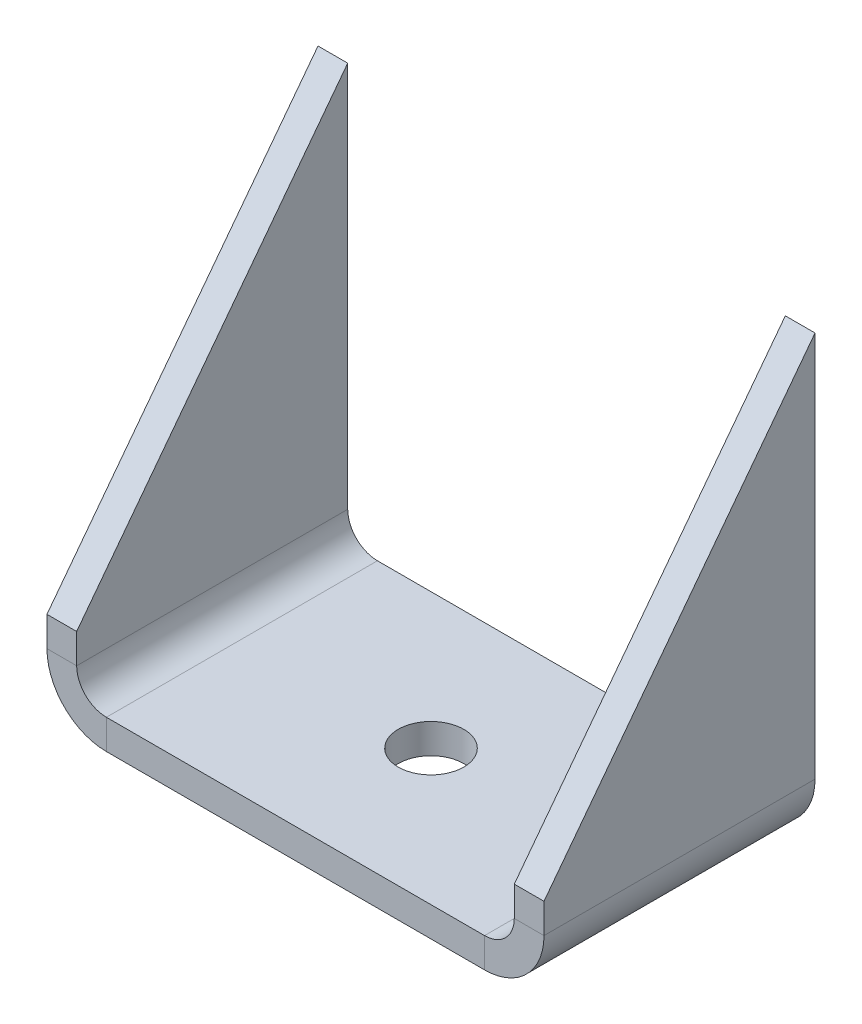
ISO-10303-21;
HEADER;
FILE_DESCRIPTION(('STEP AP214'),'2;1');
FILE_NAME('part.step','',(''),(''),'','','');
FILE_SCHEMA(('AUTOMOTIVE_DESIGN { 1 0 10303 214 1 1 1 1 }'));
ENDSEC;
DATA;
#1=APPLICATION_CONTEXT('core data for automotive mechanical design processes');
#2=APPLICATION_PROTOCOL_DEFINITION('international standard','automotive_design',2000,#1);
#3=PRODUCT_CONTEXT('',#1,'mechanical');
#4=PRODUCT('Part','Part','',(#3));
#5=PRODUCT_RELATED_PRODUCT_CATEGORY('part','',(#4));
#6=PRODUCT_DEFINITION_FORMATION('','',#4);
#7=PRODUCT_DEFINITION_CONTEXT('part definition',#1,'design');
#8=PRODUCT_DEFINITION('design','',#6,#7);
#9=PRODUCT_DEFINITION_SHAPE('','',#8);
#10=(LENGTH_UNIT() NAMED_UNIT(*) SI_UNIT(.MILLI.,.METRE.));
#11=(NAMED_UNIT(*) PLANE_ANGLE_UNIT() SI_UNIT($,.RADIAN.));
#12=(NAMED_UNIT(*) SI_UNIT($,.STERADIAN.) SOLID_ANGLE_UNIT());
#13=UNCERTAINTY_MEASURE_WITH_UNIT(LENGTH_MEASURE(1.E-05),#10,'distance_accuracy_value','');
#14=(GEOMETRIC_REPRESENTATION_CONTEXT(3) GLOBAL_UNCERTAINTY_ASSIGNED_CONTEXT((#13)) GLOBAL_UNIT_ASSIGNED_CONTEXT((#10,
#11,#12)) REPRESENTATION_CONTEXT('',''));
#15=CARTESIAN_POINT('',(0.,0.,0.));
#16=DIRECTION('',(0.,0.,1.));
#17=DIRECTION('',(1.,0.,0.));
#18=AXIS2_PLACEMENT_3D('',#15,#16,#17);
#19=CARTESIAN_POINT('',(0.,-3.175,0.));
#20=DIRECTION('',(0.,-1.,0.));
#21=DIRECTION('',(0.,0.,-1.));
#22=AXIS2_PLACEMENT_3D('',#19,#20,#21);
#23=PLANE('',#22);
#24=CARTESIAN_POINT('',(26.549999986,-3.175,-14.478));
#25=DIRECTION('',(0.,1.,0.));
#26=DIRECTION('',(0.,0.,1.));
#27=AXIS2_PLACEMENT_3D('',#24,#25,#26);
#28=CIRCLE('',#27,3.5);
#29=CARTESIAN_POINT('',(26.549999986,-3.175,-10.978));
#30=VERTEX_POINT('',#29);
#31=EDGE_CURVE('E219',#30,#30,#28,.T.);
#32=ORIENTED_EDGE('',*,*,#31,.T.);
#33=EDGE_LOOP('',(#32));
#34=FACE_BOUND('',#33,.T.);
#35=DIRECTION('',(1.,0.,0.));
#36=VECTOR('',#35,1.);
#37=CARTESIAN_POINT('',(0.,-3.175,0.));
#38=LINE('',#37,#36);
#39=CARTESIAN_POINT('',(6.34999999999999,-3.175,0.));
#40=VERTEX_POINT('',#39);
#41=CARTESIAN_POINT('',(46.749999972,-3.175,0.));
#42=VERTEX_POINT('',#41);
#43=EDGE_CURVE('E87',#40,#42,#38,.T.);
#44=ORIENTED_EDGE('',*,*,#43,.F.);
#45=DIRECTION('',(0.,0.,1.));
#46=VECTOR('',#45,1.);
#47=CARTESIAN_POINT('',(6.34999999999999,-3.175,0.));
#48=LINE('',#47,#46);
#49=CARTESIAN_POINT('',(6.34999999999998,-3.175,-28.956));
#50=VERTEX_POINT('',#49);
#51=EDGE_CURVE('E173',#40,#50,#48,.F.);
#52=ORIENTED_EDGE('',*,*,#51,.T.);
#53=DIRECTION('',(-1.,0.,0.));
#54=VECTOR('',#53,1.);
#55=CARTESIAN_POINT('',(0.,-3.175,-28.956));
#56=LINE('',#55,#54);
#57=CARTESIAN_POINT('',(46.749999972,-3.175,-28.956));
#58=VERTEX_POINT('',#57);
#59=EDGE_CURVE('E13',#58,#50,#56,.T.);
#60=ORIENTED_EDGE('',*,*,#59,.F.);
#61=DIRECTION('',(0.,0.,-1.));
#62=VECTOR('',#61,1.);
#63=CARTESIAN_POINT('',(46.749999972,-3.175,-28.956));
#64=LINE('',#63,#62);
#65=EDGE_CURVE('E262',#58,#42,#64,.F.);
#66=ORIENTED_EDGE('',*,*,#65,.T.);
#67=EDGE_LOOP('',(#44,#52,#60,#66));
#68=FACE_BOUND('',#67,.T.);
#69=ADVANCED_FACE('F78',(#34,#68),#23,.T.);
#70=CARTESIAN_POINT('',(0.,0.,0.));
#71=DIRECTION('',(0.,-1.,0.));
#72=DIRECTION('',(0.,0.,-1.));
#73=AXIS2_PLACEMENT_3D('',#70,#71,#72);
#74=PLANE('',#73);
#75=CARTESIAN_POINT('',(26.549999986,0.,-14.478));
#76=DIRECTION('',(0.,1.,0.));
#77=DIRECTION('',(0.,0.,1.));
#78=AXIS2_PLACEMENT_3D('',#75,#76,#77);
#79=CIRCLE('',#78,3.49999999999999);
#80=CARTESIAN_POINT('',(26.549999986,0.,-10.978));
#81=VERTEX_POINT('',#80);
#82=EDGE_CURVE('E318',#81,#81,#79,.T.);
#83=ORIENTED_EDGE('',*,*,#82,.F.);
#84=EDGE_LOOP('',(#83));
#85=FACE_BOUND('',#84,.T.);
#86=DIRECTION('',(0.,0.,1.));
#87=VECTOR('',#86,1.);
#88=CARTESIAN_POINT('',(6.34999999999999,0.,0.));
#89=LINE('',#88,#87);
#90=CARTESIAN_POINT('',(6.34999999999999,0.,0.));
#91=VERTEX_POINT('',#90);
#92=CARTESIAN_POINT('',(6.34999999999998,0.,-28.956));
#93=VERTEX_POINT('',#92);
#94=EDGE_CURVE('E225',#91,#93,#89,.F.);
#95=ORIENTED_EDGE('',*,*,#94,.F.);
#96=DIRECTION('',(1.,0.,0.));
#97=VECTOR('',#96,1.);
#98=CARTESIAN_POINT('',(0.,0.,0.));
#99=LINE('',#98,#97);
#100=CARTESIAN_POINT('',(46.749999972,0.,0.));
#101=VERTEX_POINT('',#100);
#102=EDGE_CURVE('E279',#91,#101,#99,.T.);
#103=ORIENTED_EDGE('',*,*,#102,.T.);
#104=DIRECTION('',(0.,0.,-1.));
#105=VECTOR('',#104,1.);
#106=CARTESIAN_POINT('',(46.749999972,0.,-28.956));
#107=LINE('',#106,#105);
#108=CARTESIAN_POINT('',(46.749999972,0.,-28.956));
#109=VERTEX_POINT('',#108);
#110=EDGE_CURVE('E273',#109,#101,#107,.F.);
#111=ORIENTED_EDGE('',*,*,#110,.F.);
#112=DIRECTION('',(-1.,0.,0.));
#113=VECTOR('',#112,1.);
#114=CARTESIAN_POINT('',(0.,0.,-28.956));
#115=LINE('',#114,#113);
#116=EDGE_CURVE('E82',#109,#93,#115,.T.);
#117=ORIENTED_EDGE('',*,*,#116,.T.);
#118=EDGE_LOOP('',(#95,#103,#111,#117));
#119=FACE_BOUND('',#118,.T.);
#120=ADVANCED_FACE('F291',(#85,#119),#74,.F.);
#121=CARTESIAN_POINT('',(0.,-3.175,0.));
#122=DIRECTION('',(0.,0.,1.));
#123=DIRECTION('',(1.,0.,0.));
#124=AXIS2_PLACEMENT_3D('',#121,#122,#123);
#125=PLANE('',#124);
#126=ORIENTED_EDGE('',*,*,#102,.F.);
#127=DIRECTION('',(0.,-1.,0.));
#128=VECTOR('',#127,1.);
#129=CARTESIAN_POINT('',(6.34999999999999,0.,0.));
#130=LINE('',#129,#128);
#131=EDGE_CURVE('E221',#91,#40,#130,.T.);
#132=ORIENTED_EDGE('',*,*,#131,.T.);
#133=ORIENTED_EDGE('',*,*,#43,.T.);
#134=DIRECTION('',(0.,-1.,0.));
#135=VECTOR('',#134,1.);
#136=CARTESIAN_POINT('',(46.749999972,0.,0.));
#137=LINE('',#136,#135);
#138=EDGE_CURVE('E277',#101,#42,#137,.T.);
#139=ORIENTED_EDGE('',*,*,#138,.F.);
#140=EDGE_LOOP('',(#126,#132,#133,#139));
#141=FACE_BOUND('',#140,.T.);
#142=ADVANCED_FACE('F80',(#141),#125,.T.);
#143=CARTESIAN_POINT('',(0.,-3.175,-28.956));
#144=DIRECTION('',(0.,0.,-1.));
#145=DIRECTION('',(-1.,0.,0.));
#146=AXIS2_PLACEMENT_3D('',#143,#144,#145);
#147=PLANE('',#146);
#148=DIRECTION('',(0.,-1.,0.));
#149=VECTOR('',#148,1.);
#150=CARTESIAN_POINT('',(6.34999999999998,0.,-28.956));
#151=LINE('',#150,#149);
#152=EDGE_CURVE('E228',#93,#50,#151,.T.);
#153=ORIENTED_EDGE('',*,*,#152,.F.);
#154=ORIENTED_EDGE('',*,*,#116,.F.);
#155=DIRECTION('',(0.,-1.,0.));
#156=VECTOR('',#155,1.);
#157=CARTESIAN_POINT('',(46.749999972,0.,-28.956));
#158=LINE('',#157,#156);
#159=EDGE_CURVE('E267',#109,#58,#158,.T.);
#160=ORIENTED_EDGE('',*,*,#159,.T.);
#161=ORIENTED_EDGE('',*,*,#59,.T.);
#162=EDGE_LOOP('',(#153,#154,#160,#161));
#163=FACE_BOUND('',#162,.T.);
#164=ADVANCED_FACE('F294',(#163),#147,.T.);
#165=CARTESIAN_POINT('',(46.749999972,3.175,0.));
#166=DIRECTION('',(0.,0.,1.));
#167=DIRECTION('',(1.,0.,0.));
#168=AXIS2_PLACEMENT_3D('',#165,#166,#167);
#169=PLANE('',#168);
#170=DIRECTION('',(-1.,0.,0.));
#171=VECTOR('',#170,1.);
#172=CARTESIAN_POINT('',(53.099999972,3.17499999999998,0.));
#173=LINE('',#172,#171);
#174=CARTESIAN_POINT('',(49.924999972,3.17499999999999,0.));
#175=VERTEX_POINT('',#174);
#176=CARTESIAN_POINT('',(53.099999972,3.17499999999998,0.));
#177=VERTEX_POINT('',#176);
#178=EDGE_CURVE('E230',#175,#177,#173,.F.);
#179=ORIENTED_EDGE('',*,*,#178,.F.);
#180=CARTESIAN_POINT('',(46.749999972,3.175,0.));
#181=DIRECTION('',(0.,0.,-1.));
#182=DIRECTION('',(-1.,0.,0.));
#183=AXIS2_PLACEMENT_3D('',#180,#181,#182);
#184=CIRCLE('',#183,3.175);
#185=EDGE_CURVE('E270',#101,#175,#184,.F.);
#186=ORIENTED_EDGE('',*,*,#185,.F.);
#187=ORIENTED_EDGE('',*,*,#138,.T.);
#188=CARTESIAN_POINT('',(46.749999972,3.175,0.));
#189=DIRECTION('',(0.,0.,-1.));
#190=DIRECTION('',(-1.,0.,0.));
#191=AXIS2_PLACEMENT_3D('',#188,#189,#190);
#192=CIRCLE('',#191,6.35);
#193=EDGE_CURVE('E95',#42,#177,#192,.F.);
#194=ORIENTED_EDGE('',*,*,#193,.T.);
#195=EDGE_LOOP('',(#179,#186,#187,#194));
#196=FACE_BOUND('',#195,.T.);
#197=ADVANCED_FACE('F335',(#196),#169,.T.);
#198=CARTESIAN_POINT('',(46.749999972,3.175,-28.956));
#199=DIRECTION('',(0.,0.,1.));
#200=DIRECTION('',(1.,0.,0.));
#201=AXIS2_PLACEMENT_3D('',#198,#199,#200);
#202=PLANE('',#201);
#203=CARTESIAN_POINT('',(46.749999972,3.175,-28.956));
#204=DIRECTION('',(0.,0.,-1.));
#205=DIRECTION('',(-1.,0.,0.));
#206=AXIS2_PLACEMENT_3D('',#203,#204,#205);
#207=CIRCLE('',#206,3.175);
#208=CARTESIAN_POINT('',(49.924999972,3.17499999999999,-28.956));
#209=VERTEX_POINT('',#208);
#210=EDGE_CURVE('E235',#209,#109,#207,.T.);
#211=ORIENTED_EDGE('',*,*,#210,.F.);
#212=DIRECTION('',(-1.,0.,0.));
#213=VECTOR('',#212,1.);
#214=CARTESIAN_POINT('',(49.924999972,3.17499999999999,-28.956));
#215=LINE('',#214,#213);
#216=CARTESIAN_POINT('',(53.099999972,3.17499999999998,-28.956));
#217=VERTEX_POINT('',#216);
#218=EDGE_CURVE('E255',#209,#217,#215,.F.);
#219=ORIENTED_EDGE('',*,*,#218,.T.);
#220=CARTESIAN_POINT('',(46.749999972,3.175,-28.956));
#221=DIRECTION('',(0.,0.,-1.));
#222=DIRECTION('',(-1.,0.,0.));
#223=AXIS2_PLACEMENT_3D('',#220,#221,#222);
#224=CIRCLE('',#223,6.35);
#225=EDGE_CURVE('E265',#217,#58,#224,.T.);
#226=ORIENTED_EDGE('',*,*,#225,.T.);
#227=ORIENTED_EDGE('',*,*,#159,.F.);
#228=EDGE_LOOP('',(#211,#219,#226,#227));
#229=FACE_BOUND('',#228,.T.);
#230=ADVANCED_FACE('F339',(#229),#202,.F.);
#231=CARTESIAN_POINT('',(46.749999972,3.175,-28.956));
#232=DIRECTION('',(0.,0.,-1.));
#233=DIRECTION('',(1.,0.,0.));
#234=AXIS2_PLACEMENT_3D('',#231,#232,#233);
#235=CYLINDRICAL_SURFACE('',#234,6.35);
#236=ORIENTED_EDGE('',*,*,#65,.F.);
#237=ORIENTED_EDGE('',*,*,#225,.F.);
#238=DIRECTION('',(0.,0.,-1.));
#239=VECTOR('',#238,1.);
#240=CARTESIAN_POINT('',(53.099999972,3.17499999999998,0.));
#241=LINE('',#240,#239);
#242=EDGE_CURVE('E253',#217,#177,#241,.F.);
#243=ORIENTED_EDGE('',*,*,#242,.T.);
#244=ORIENTED_EDGE('',*,*,#193,.F.);
#245=EDGE_LOOP('',(#236,#237,#243,#244));
#246=FACE_BOUND('',#245,.T.);
#247=ADVANCED_FACE('F345',(#246),#235,.T.);
#248=CARTESIAN_POINT('',(46.749999972,3.175,-28.956));
#249=DIRECTION('',(0.,0.,-1.));
#250=DIRECTION('',(1.,0.,0.));
#251=AXIS2_PLACEMENT_3D('',#248,#249,#250);
#252=CYLINDRICAL_SURFACE('',#251,3.175);
#253=ORIENTED_EDGE('',*,*,#110,.T.);
#254=ORIENTED_EDGE('',*,*,#185,.T.);
#255=DIRECTION('',(0.,0.,-1.));
#256=VECTOR('',#255,1.);
#257=CARTESIAN_POINT('',(49.924999972,3.17499999999999,0.));
#258=LINE('',#257,#256);
#259=EDGE_CURVE('E258',#175,#209,#258,.T.);
#260=ORIENTED_EDGE('',*,*,#259,.T.);
#261=ORIENTED_EDGE('',*,*,#210,.T.);
#262=EDGE_LOOP('',(#253,#254,#260,#261));
#263=FACE_BOUND('',#262,.T.);
#264=ADVANCED_FACE('F348',(#263),#252,.F.);
#265=CARTESIAN_POINT('',(53.099999972,0.,0.));
#266=DIRECTION('',(0.,0.,-1.));
#267=DIRECTION('',(-1.,0.,0.));
#268=AXIS2_PLACEMENT_3D('',#265,#266,#267);
#269=PLANE('',#268);
#270=ORIENTED_EDGE('',*,*,#178,.T.);
#271=DIRECTION('',(0.,-1.,0.));
#272=VECTOR('',#271,1.);
#273=CARTESIAN_POINT('',(53.099999972,-1.85158807315324E-13,0.));
#274=LINE('',#273,#272);
#275=CARTESIAN_POINT('',(53.099999972,6.34999999999999,0.));
#276=VERTEX_POINT('',#275);
#277=EDGE_CURVE('E243',#276,#177,#274,.T.);
#278=ORIENTED_EDGE('',*,*,#277,.F.);
#279=DIRECTION('',(-1.,0.,0.));
#280=VECTOR('',#279,1.);
#281=CARTESIAN_POINT('',(53.099999972,6.34999999999999,0.));
#282=LINE('',#281,#280);
#283=CARTESIAN_POINT('',(49.924999972,6.35,0.));
#284=VERTEX_POINT('',#283);
#285=EDGE_CURVE('E236',#276,#284,#282,.T.);
#286=ORIENTED_EDGE('',*,*,#285,.T.);
#287=DIRECTION('',(0.,1.,0.));
#288=VECTOR('',#287,1.);
#289=CARTESIAN_POINT('',(49.924999972,0.,0.));
#290=LINE('',#289,#288);
#291=EDGE_CURVE('E250',#284,#175,#290,.F.);
#292=ORIENTED_EDGE('',*,*,#291,.T.);
#293=EDGE_LOOP('',(#270,#278,#286,#292));
#294=FACE_BOUND('',#293,.T.);
#295=ADVANCED_FACE('F351',(#294),#269,.F.);
#296=CARTESIAN_POINT('',(53.0999999720001,44.45,-28.956));
#297=DIRECTION('',(0.,0.,1.));
#298=DIRECTION('',(0.,-1.,0.));
#299=AXIS2_PLACEMENT_3D('',#296,#297,#298);
#300=PLANE('',#299);
#301=ORIENTED_EDGE('',*,*,#218,.F.);
#302=DIRECTION('',(0.,-1.,0.));
#303=VECTOR('',#302,1.);
#304=CARTESIAN_POINT('',(49.9249999720001,44.45,-28.956));
#305=LINE('',#304,#303);
#306=CARTESIAN_POINT('',(49.9249999720001,44.45,-28.956));
#307=VERTEX_POINT('',#306);
#308=EDGE_CURVE('E248',#209,#307,#305,.F.);
#309=ORIENTED_EDGE('',*,*,#308,.T.);
#310=DIRECTION('',(-1.,0.,0.));
#311=VECTOR('',#310,1.);
#312=CARTESIAN_POINT('',(53.0999999720001,44.45,-28.956));
#313=LINE('',#312,#311);
#314=CARTESIAN_POINT('',(53.0999999720001,44.45,-28.956));
#315=VERTEX_POINT('',#314);
#316=EDGE_CURVE('E232',#315,#307,#313,.T.);
#317=ORIENTED_EDGE('',*,*,#316,.F.);
#318=DIRECTION('',(0.,1.,0.));
#319=VECTOR('',#318,1.);
#320=CARTESIAN_POINT('',(53.099999972,-1.82898710443765E-13,-28.956));
#321=LINE('',#320,#319);
#322=EDGE_CURVE('E241',#217,#315,#321,.T.);
#323=ORIENTED_EDGE('',*,*,#322,.F.);
#324=EDGE_LOOP('',(#301,#309,#317,#323));
#325=FACE_BOUND('',#324,.T.);
#326=ADVANCED_FACE('F357',(#325),#300,.F.);
#327=CARTESIAN_POINT('',(53.099999972,-1.85158807315324E-13,0.));
#328=DIRECTION('',(-1.,0.,0.));
#329=DIRECTION('',(0.,-1.,0.));
#330=AXIS2_PLACEMENT_3D('',#327,#328,#329);
#331=PLANE('',#330);
#332=ORIENTED_EDGE('',*,*,#242,.F.);
#333=ORIENTED_EDGE('',*,*,#322,.T.);
#334=DIRECTION('',(0.,-0.796162194123103,0.605083267533558));
#335=VECTOR('',#334,1.);
#336=CARTESIAN_POINT('',(53.099999972,2.32489858012158,3.05907707910759));
#337=LINE('',#336,#335);
#338=EDGE_CURVE('E239',#315,#276,#337,.T.);
#339=ORIENTED_EDGE('',*,*,#338,.T.);
#340=ORIENTED_EDGE('',*,*,#277,.T.);
#341=EDGE_LOOP('',(#332,#333,#339,#340));
#342=FACE_BOUND('',#341,.T.);
#343=ADVANCED_FACE('F361',(#342),#331,.F.);
#344=CARTESIAN_POINT('',(49.924999972,-1.74073354064497E-13,0.));
#345=DIRECTION('',(-1.,0.,0.));
#346=DIRECTION('',(0.,-1.,0.));
#347=AXIS2_PLACEMENT_3D('',#344,#345,#346);
#348=PLANE('',#347);
#349=ORIENTED_EDGE('',*,*,#308,.F.);
#350=ORIENTED_EDGE('',*,*,#259,.F.);
#351=ORIENTED_EDGE('',*,*,#291,.F.);
#352=DIRECTION('',(0.,0.796162194123103,-0.605083267533558));
#353=VECTOR('',#352,1.);
#354=CARTESIAN_POINT('',(49.924999972,6.35,0.));
#355=LINE('',#354,#353);
#356=EDGE_CURVE('E246',#307,#284,#355,.F.);
#357=ORIENTED_EDGE('',*,*,#356,.F.);
#358=EDGE_LOOP('',(#349,#350,#351,#357));
#359=FACE_BOUND('',#358,.T.);
#360=ADVANCED_FACE('F366',(#359),#348,.T.);
#361=CARTESIAN_POINT('',(53.099999972,6.34999999999999,0.));
#362=DIRECTION('',(0.,-0.605083267533558,-0.796162194123103));
#363=DIRECTION('',(0.,0.796162194123103,-0.605083267533558));
#364=AXIS2_PLACEMENT_3D('',#361,#362,#363);
#365=PLANE('',#364);
#366=ORIENTED_EDGE('',*,*,#356,.T.);
#367=ORIENTED_EDGE('',*,*,#285,.F.);
#368=ORIENTED_EDGE('',*,*,#338,.F.);
#369=ORIENTED_EDGE('',*,*,#316,.T.);
#370=EDGE_LOOP('',(#366,#367,#368,#369));
#371=FACE_BOUND('',#370,.T.);
#372=ADVANCED_FACE('F363',(#371),#365,.F.);
#373=CARTESIAN_POINT('',(6.34999999999999,3.175,-28.956));
#374=DIRECTION('',(0.,0.,-1.));
#375=DIRECTION('',(-1.,0.,0.));
#376=AXIS2_PLACEMENT_3D('',#373,#374,#375);
#377=PLANE('',#376);
#378=DIRECTION('',(1.,0.,0.));
#379=VECTOR('',#378,1.);
#380=CARTESIAN_POINT('',(0.,3.17499999999998,-28.956));
#381=LINE('',#380,#379);
#382=CARTESIAN_POINT('',(3.17499999999999,3.17499999999999,-28.956));
#383=VERTEX_POINT('',#382);
#384=CARTESIAN_POINT('',(0.,3.17499999999998,-28.956));
#385=VERTEX_POINT('',#384);
#386=EDGE_CURVE('E216',#383,#385,#381,.F.);
#387=ORIENTED_EDGE('',*,*,#386,.F.);
#388=CARTESIAN_POINT('',(6.34999999999999,3.175,-28.956));
#389=DIRECTION('',(0.,0.,1.));
#390=DIRECTION('',(1.,0.,0.));
#391=AXIS2_PLACEMENT_3D('',#388,#389,#390);
#392=CIRCLE('',#391,3.175);
#393=EDGE_CURVE('E176',#93,#383,#392,.F.);
#394=ORIENTED_EDGE('',*,*,#393,.F.);
#395=ORIENTED_EDGE('',*,*,#152,.T.);
#396=CARTESIAN_POINT('',(6.34999999999999,3.175,-28.956));
#397=DIRECTION('',(0.,0.,1.));
#398=DIRECTION('',(1.,0.,0.));
#399=AXIS2_PLACEMENT_3D('',#396,#397,#398);
#400=CIRCLE('',#399,6.35);
#401=EDGE_CURVE('E103',#50,#385,#400,.F.);
#402=ORIENTED_EDGE('',*,*,#401,.T.);
#403=EDGE_LOOP('',(#387,#394,#395,#402));
#404=FACE_BOUND('',#403,.T.);
#405=ADVANCED_FACE('F298',(#404),#377,.T.);
#406=CARTESIAN_POINT('',(6.34999999999999,3.175,0.));
#407=DIRECTION('',(0.,0.,-1.));
#408=DIRECTION('',(-1.,0.,0.));
#409=AXIS2_PLACEMENT_3D('',#406,#407,#408);
#410=PLANE('',#409);
#411=CARTESIAN_POINT('',(6.34999999999999,3.175,0.));
#412=DIRECTION('',(0.,0.,1.));
#413=DIRECTION('',(1.,0.,0.));
#414=AXIS2_PLACEMENT_3D('',#411,#412,#413);
#415=CIRCLE('',#414,3.175);
#416=CARTESIAN_POINT('',(3.17499999999999,3.17499999999999,0.));
#417=VERTEX_POINT('',#416);
#418=EDGE_CURVE('E183',#417,#91,#415,.T.);
#419=ORIENTED_EDGE('',*,*,#418,.F.);
#420=DIRECTION('',(1.,0.,0.));
#421=VECTOR('',#420,1.);
#422=CARTESIAN_POINT('',(3.17499999999999,3.17499999999999,0.));
#423=LINE('',#422,#421);
#424=CARTESIAN_POINT('',(0.,3.17499999999998,0.));
#425=VERTEX_POINT('',#424);
#426=EDGE_CURVE('E180',#417,#425,#423,.F.);
#427=ORIENTED_EDGE('',*,*,#426,.T.);
#428=CARTESIAN_POINT('',(6.34999999999999,3.175,0.));
#429=DIRECTION('',(0.,0.,1.));
#430=DIRECTION('',(1.,0.,0.));
#431=AXIS2_PLACEMENT_3D('',#428,#429,#430);
#432=CIRCLE('',#431,6.35);
#433=EDGE_CURVE('E167',#425,#40,#432,.T.);
#434=ORIENTED_EDGE('',*,*,#433,.T.);
#435=ORIENTED_EDGE('',*,*,#131,.F.);
#436=EDGE_LOOP('',(#419,#427,#434,#435));
#437=FACE_BOUND('',#436,.T.);
#438=ADVANCED_FACE('F181',(#437),#410,.F.);
#439=CARTESIAN_POINT('',(6.34999999999999,3.175,0.));
#440=DIRECTION('',(0.,0.,1.));
#441=DIRECTION('',(-1.,0.,0.));
#442=AXIS2_PLACEMENT_3D('',#439,#440,#441);
#443=CYLINDRICAL_SURFACE('',#442,6.35);
#444=ORIENTED_EDGE('',*,*,#51,.F.);
#445=ORIENTED_EDGE('',*,*,#433,.F.);
#446=DIRECTION('',(0.,0.,1.));
#447=VECTOR('',#446,1.);
#448=CARTESIAN_POINT('',(0.,3.17499999999998,0.));
#449=LINE('',#448,#447);
#450=EDGE_CURVE('E171',#385,#425,#449,.T.);
#451=ORIENTED_EDGE('',*,*,#450,.F.);
#452=ORIENTED_EDGE('',*,*,#401,.F.);
#453=EDGE_LOOP('',(#444,#445,#451,#452));
#454=FACE_BOUND('',#453,.T.);
#455=ADVANCED_FACE('F169',(#454),#443,.T.);
#456=CARTESIAN_POINT('',(6.34999999999999,3.175,0.));
#457=DIRECTION('',(0.,0.,1.));
#458=DIRECTION('',(-1.,0.,0.));
#459=AXIS2_PLACEMENT_3D('',#456,#457,#458);
#460=CYLINDRICAL_SURFACE('',#459,3.175);
#461=ORIENTED_EDGE('',*,*,#94,.T.);
#462=ORIENTED_EDGE('',*,*,#393,.T.);
#463=DIRECTION('',(0.,0.,-1.));
#464=VECTOR('',#463,1.);
#465=CARTESIAN_POINT('',(3.17499999999999,3.17499999999999,-28.956));
#466=LINE('',#465,#464);
#467=EDGE_CURVE('E187',#383,#417,#466,.F.);
#468=ORIENTED_EDGE('',*,*,#467,.T.);
#469=ORIENTED_EDGE('',*,*,#418,.T.);
#470=EDGE_LOOP('',(#461,#462,#468,#469));
#471=FACE_BOUND('',#470,.T.);
#472=ADVANCED_FACE('F303',(#471),#460,.F.);
#473=CARTESIAN_POINT('',(-1.55257751099924E-13,44.4499999999998,-28.956));
#474=DIRECTION('',(0.,0.,1.));
#475=DIRECTION('',(0.,-1.,0.));
#476=AXIS2_PLACEMENT_3D('',#473,#474,#475);
#477=PLANE('',#476);
#478=ORIENTED_EDGE('',*,*,#386,.T.);
#479=DIRECTION('',(0.,1.,0.));
#480=VECTOR('',#479,1.);
#481=CARTESIAN_POINT('',(0.,0.,-28.956));
#482=LINE('',#481,#480);
#483=CARTESIAN_POINT('',(-1.55196345511577E-13,44.4499999999998,-28.956));
#484=VERTEX_POINT('',#483);
#485=EDGE_CURVE('E195',#484,#385,#482,.F.);
#486=ORIENTED_EDGE('',*,*,#485,.F.);
#487=DIRECTION('',(1.,0.,0.));
#488=VECTOR('',#487,1.);
#489=CARTESIAN_POINT('',(-1.55257751099924E-13,44.4499999999998,-28.956));
#490=LINE('',#489,#488);
#491=CARTESIAN_POINT('',(3.17499999999984,44.4499999999998,-28.956));
#492=VERTEX_POINT('',#491);
#493=EDGE_CURVE('E204',#484,#492,#490,.T.);
#494=ORIENTED_EDGE('',*,*,#493,.T.);
#495=DIRECTION('',(0.,-1.,0.));
#496=VECTOR('',#495,1.);
#497=CARTESIAN_POINT('',(3.17499999999984,44.4499999999998,-28.956));
#498=LINE('',#497,#496);
#499=EDGE_CURVE('E196',#492,#383,#498,.T.);
#500=ORIENTED_EDGE('',*,*,#499,.T.);
#501=EDGE_LOOP('',(#478,#486,#494,#500));
#502=FACE_BOUND('',#501,.T.);
#503=ADVANCED_FACE('F311',(#502),#477,.F.);
#504=CARTESIAN_POINT('',(0.,0.,0.));
#505=DIRECTION('',(0.,0.,-1.));
#506=DIRECTION('',(-1.,0.,0.));
#507=AXIS2_PLACEMENT_3D('',#504,#505,#506);
#508=PLANE('',#507);
#509=ORIENTED_EDGE('',*,*,#426,.F.);
#510=DIRECTION('',(0.,1.,0.));
#511=VECTOR('',#510,1.);
#512=CARTESIAN_POINT('',(3.175,0.,0.));
#513=LINE('',#512,#511);
#514=CARTESIAN_POINT('',(3.17499999999998,6.34999999999981,0.));
#515=VERTEX_POINT('',#514);
#516=EDGE_CURVE('E211',#417,#515,#513,.T.);
#517=ORIENTED_EDGE('',*,*,#516,.T.);
#518=DIRECTION('',(1.,0.,0.));
#519=VECTOR('',#518,1.);
#520=CARTESIAN_POINT('',(0.,6.3499999999998,0.));
#521=LINE('',#520,#519);
#522=CARTESIAN_POINT('',(0.,6.3499999999998,0.));
#523=VERTEX_POINT('',#522);
#524=EDGE_CURVE('E200',#523,#515,#521,.T.);
#525=ORIENTED_EDGE('',*,*,#524,.F.);
#526=DIRECTION('',(0.,-1.,0.));
#527=VECTOR('',#526,1.);
#528=CARTESIAN_POINT('',(0.,0.,0.));
#529=LINE('',#528,#527);
#530=EDGE_CURVE('E192',#425,#523,#529,.F.);
#531=ORIENTED_EDGE('',*,*,#530,.F.);
#532=EDGE_LOOP('',(#509,#517,#525,#531));
#533=FACE_BOUND('',#532,.T.);
#534=ADVANCED_FACE('F198',(#533),#508,.F.);
#535=CARTESIAN_POINT('',(0.,0.,0.));
#536=DIRECTION('',(-1.,0.,0.));
#537=DIRECTION('',(0.,-1.,0.));
#538=AXIS2_PLACEMENT_3D('',#535,#536,#537);
#539=PLANE('',#538);
#540=ORIENTED_EDGE('',*,*,#485,.T.);
#541=ORIENTED_EDGE('',*,*,#450,.T.);
#542=ORIENTED_EDGE('',*,*,#530,.T.);
#543=DIRECTION('',(0.,-0.796162194123103,0.605083267533558));
#544=VECTOR('',#543,1.);
#545=CARTESIAN_POINT('',(0.,2.32489858012162,3.05907707910742));
#546=LINE('',#545,#544);
#547=EDGE_CURVE('E202',#523,#484,#546,.F.);
#548=ORIENTED_EDGE('',*,*,#547,.T.);
#549=EDGE_LOOP('',(#540,#541,#542,#548));
#550=FACE_BOUND('',#549,.T.);
#551=ADVANCED_FACE('F191',(#550),#539,.T.);
#552=CARTESIAN_POINT('',(3.175,0.,0.));
#553=DIRECTION('',(-1.,0.,0.));
#554=DIRECTION('',(0.,-1.,0.));
#555=AXIS2_PLACEMENT_3D('',#552,#553,#554);
#556=PLANE('',#555);
#557=ORIENTED_EDGE('',*,*,#467,.F.);
#558=ORIENTED_EDGE('',*,*,#499,.F.);
#559=DIRECTION('',(0.,0.796162194123103,-0.605083267533558));
#560=VECTOR('',#559,1.);
#561=CARTESIAN_POINT('',(3.17499999999998,6.34999999999981,0.));
#562=LINE('',#561,#560);
#563=EDGE_CURVE('E206',#515,#492,#562,.T.);
#564=ORIENTED_EDGE('',*,*,#563,.F.);
#565=ORIENTED_EDGE('',*,*,#516,.F.);
#566=EDGE_LOOP('',(#557,#558,#564,#565));
#567=FACE_BOUND('',#566,.T.);
#568=ADVANCED_FACE('F307',(#567),#556,.F.);
#569=CARTESIAN_POINT('',(0.,6.3499999999998,0.));
#570=DIRECTION('',(0.,-0.605083267533558,-0.796162194123103));
#571=DIRECTION('',(0.,0.796162194123103,-0.605083267533558));
#572=AXIS2_PLACEMENT_3D('',#569,#570,#571);
#573=PLANE('',#572);
#574=ORIENTED_EDGE('',*,*,#563,.T.);
#575=ORIENTED_EDGE('',*,*,#493,.F.);
#576=ORIENTED_EDGE('',*,*,#547,.F.);
#577=ORIENTED_EDGE('',*,*,#524,.T.);
#578=EDGE_LOOP('',(#574,#575,#576,#577));
#579=FACE_BOUND('',#578,.T.);
#580=ADVANCED_FACE('F386',(#579),#573,.F.);
#581=CARTESIAN_POINT('',(26.549999986,0.,-14.478));
#582=DIRECTION('',(0.,1.,0.));
#583=DIRECTION('',(0.,0.,1.));
#584=AXIS2_PLACEMENT_3D('',#581,#582,#583);
#585=CYLINDRICAL_SURFACE('',#584,3.49999999999999);
#586=ORIENTED_EDGE('',*,*,#31,.F.);
#587=EDGE_LOOP('',(#586));
#588=FACE_BOUND('',#587,.T.);
#589=ORIENTED_EDGE('',*,*,#82,.T.);
#590=EDGE_LOOP('',(#589));
#591=FACE_BOUND('',#590,.T.);
#592=ADVANCED_FACE('F322',(#588,#591),#585,.F.);
#593=CLOSED_SHELL('',(#69,#120,#142,#164,#197,#230,#247,#264,#295,#326,#343,#360,#372,#405,#438,
#455,#472,#503,#534,#551,#568,#580,#592));
#594=MANIFOLD_SOLID_BREP('B2',#593);
#595=ADVANCED_BREP_SHAPE_REPRESENTATION('',(#18,#594),#14);
#596=SHAPE_DEFINITION_REPRESENTATION(#9,#595);
ENDSEC;
END-ISO-10303-21;
